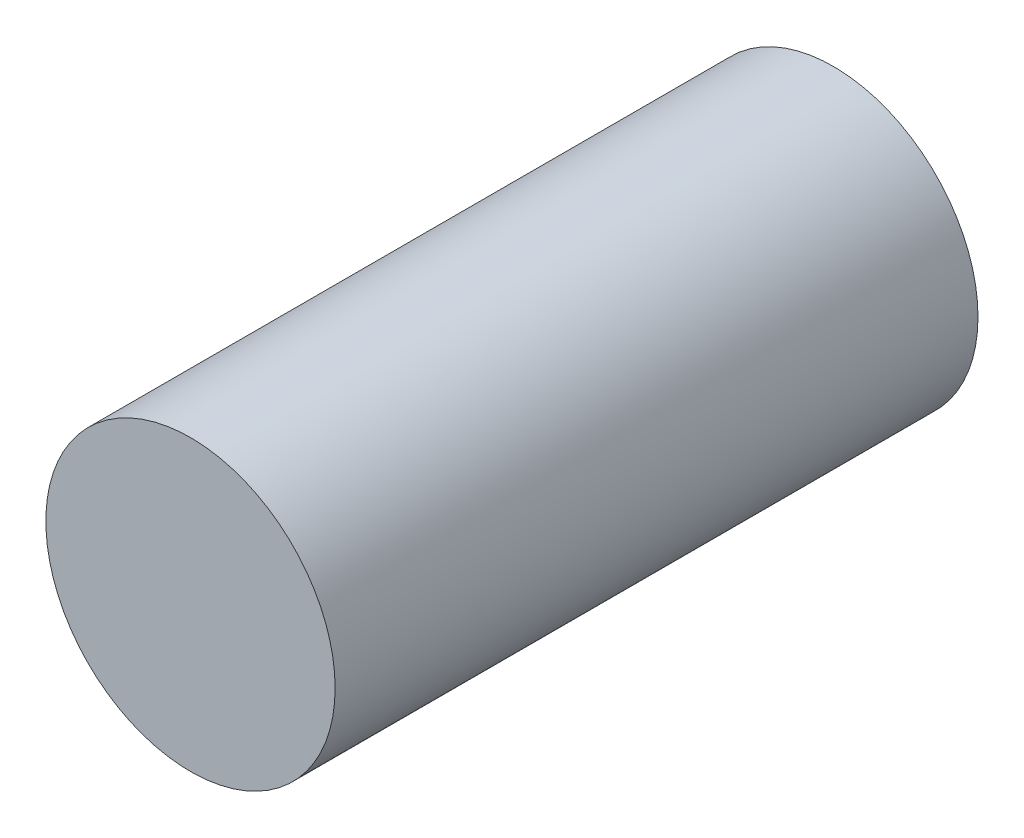
ISO-10303-21;
HEADER;
FILE_DESCRIPTION(('STEP AP214'),'2;1');
FILE_NAME('part.step','',(''),(''),'','','');
FILE_SCHEMA(('AUTOMOTIVE_DESIGN { 1 0 10303 214 1 1 1 1 }'));
ENDSEC;
DATA;
#1=APPLICATION_CONTEXT('core data for automotive mechanical design processes');
#2=APPLICATION_PROTOCOL_DEFINITION('international standard','automotive_design',2000,#1);
#3=PRODUCT_CONTEXT('',#1,'mechanical');
#4=PRODUCT('Part','Part','',(#3));
#5=PRODUCT_RELATED_PRODUCT_CATEGORY('part','',(#4));
#6=PRODUCT_DEFINITION_FORMATION('','',#4);
#7=PRODUCT_DEFINITION_CONTEXT('part definition',#1,'design');
#8=PRODUCT_DEFINITION('design','',#6,#7);
#9=PRODUCT_DEFINITION_SHAPE('','',#8);
#10=(LENGTH_UNIT() NAMED_UNIT(*) SI_UNIT(.MILLI.,.METRE.));
#11=(NAMED_UNIT(*) PLANE_ANGLE_UNIT() SI_UNIT($,.RADIAN.));
#12=(NAMED_UNIT(*) SI_UNIT($,.STERADIAN.) SOLID_ANGLE_UNIT());
#13=UNCERTAINTY_MEASURE_WITH_UNIT(LENGTH_MEASURE(1.E-05),#10,'distance_accuracy_value','');
#14=(GEOMETRIC_REPRESENTATION_CONTEXT(3) GLOBAL_UNCERTAINTY_ASSIGNED_CONTEXT((#13)) GLOBAL_UNIT_ASSIGNED_CONTEXT((#10,
#11,#12)) REPRESENTATION_CONTEXT('',''));
#15=CARTESIAN_POINT('',(0.,0.,0.));
#16=DIRECTION('',(0.,0.,1.));
#17=DIRECTION('',(1.,0.,0.));
#18=AXIS2_PLACEMENT_3D('',#15,#16,#17);
#19=CARTESIAN_POINT('',(0.,0.,10.));
#20=DIRECTION('',(0.,0.,-1.));
#21=DIRECTION('',(-1.,0.,0.));
#22=AXIS2_PLACEMENT_3D('',#19,#20,#21);
#23=CYLINDRICAL_SURFACE('',#22,2.25);
#24=CARTESIAN_POINT('',(0.,0.,10.));
#25=DIRECTION('',(0.,0.,1.));
#26=DIRECTION('',(1.,0.,0.));
#27=AXIS2_PLACEMENT_3D('',#24,#25,#26);
#28=CIRCLE('',#27,2.25);
#29=CARTESIAN_POINT('',(2.25,0.,10.));
#30=VERTEX_POINT('',#29);
#31=EDGE_CURVE('E10',#30,#30,#28,.T.);
#32=ORIENTED_EDGE('',*,*,#31,.F.);
#33=EDGE_LOOP('',(#32));
#34=FACE_BOUND('',#33,.T.);
#35=CARTESIAN_POINT('',(0.,0.,0.));
#36=DIRECTION('',(0.,0.,1.));
#37=DIRECTION('',(1.,0.,0.));
#38=AXIS2_PLACEMENT_3D('',#35,#36,#37);
#39=CIRCLE('',#38,2.25);
#40=CARTESIAN_POINT('',(2.25,0.,0.));
#41=VERTEX_POINT('',#40);
#42=EDGE_CURVE('E44',#41,#41,#39,.T.);
#43=ORIENTED_EDGE('',*,*,#42,.T.);
#44=EDGE_LOOP('',(#43));
#45=FACE_BOUND('',#44,.T.);
#46=ADVANCED_FACE('F41',(#34,#45),#23,.T.);
#47=CARTESIAN_POINT('',(0.,0.,10.));
#48=DIRECTION('',(0.,0.,1.));
#49=DIRECTION('',(1.,0.,0.));
#50=AXIS2_PLACEMENT_3D('',#47,#48,#49);
#51=PLANE('',#50);
#52=ORIENTED_EDGE('',*,*,#31,.T.);
#53=EDGE_LOOP('',(#52));
#54=FACE_BOUND('',#53,.T.);
#55=ADVANCED_FACE('F58',(#54),#51,.T.);
#56=CARTESIAN_POINT('',(0.,0.,0.));
#57=DIRECTION('',(0.,0.,1.));
#58=DIRECTION('',(1.,0.,0.));
#59=AXIS2_PLACEMENT_3D('',#56,#57,#58);
#60=PLANE('',#59);
#61=ORIENTED_EDGE('',*,*,#42,.F.);
#62=EDGE_LOOP('',(#61));
#63=FACE_BOUND('',#62,.T.);
#64=ADVANCED_FACE('F56',(#63),#60,.F.);
#65=CLOSED_SHELL('',(#46,#55,#64));
#66=MANIFOLD_SOLID_BREP('B2',#65);
#67=ADVANCED_BREP_SHAPE_REPRESENTATION('',(#18,#66),#14);
#68=SHAPE_DEFINITION_REPRESENTATION(#9,#67);
ENDSEC;
END-ISO-10303-21;
